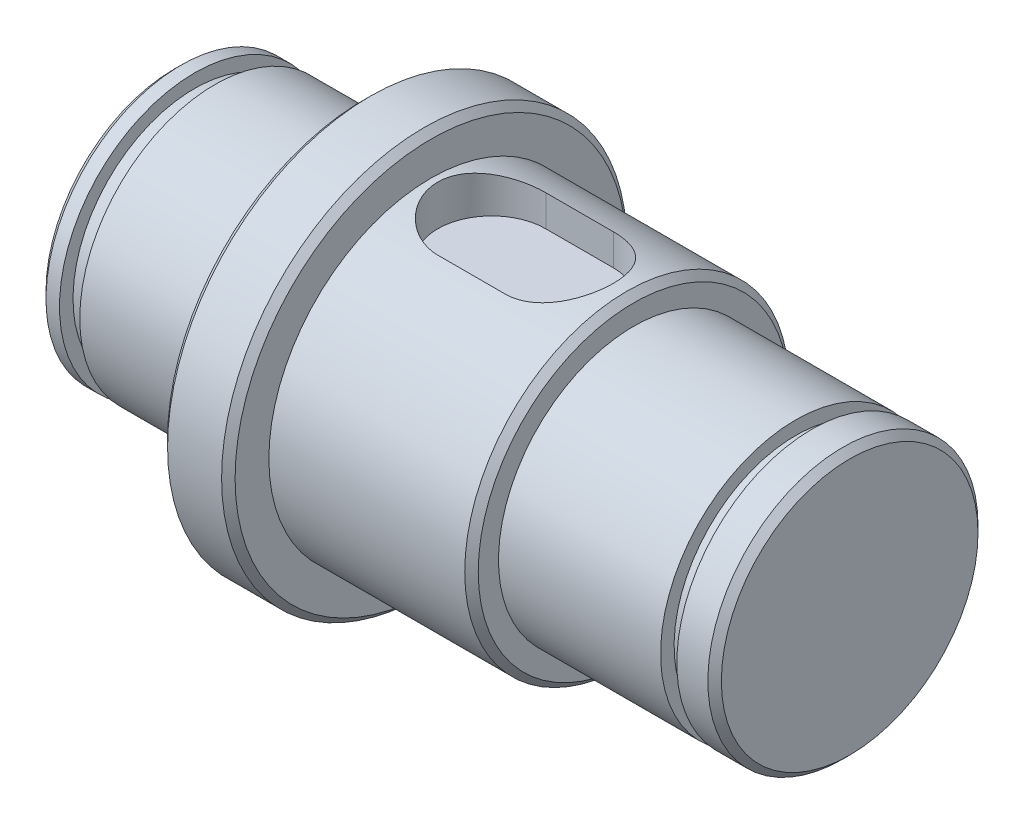
ISO-10303-21;
HEADER;
FILE_DESCRIPTION(('STEP AP214'),'2;1');
FILE_NAME('part.step','',(''),(''),'','','');
FILE_SCHEMA(('AUTOMOTIVE_DESIGN { 1 0 10303 214 1 1 1 1 }'));
ENDSEC;
DATA;
#1=APPLICATION_CONTEXT('core data for automotive mechanical design processes');
#2=APPLICATION_PROTOCOL_DEFINITION('international standard','automotive_design',2000,#1);
#3=PRODUCT_CONTEXT('',#1,'mechanical');
#4=PRODUCT('Part','Part','',(#3));
#5=PRODUCT_RELATED_PRODUCT_CATEGORY('part','',(#4));
#6=PRODUCT_DEFINITION_FORMATION('','',#4);
#7=PRODUCT_DEFINITION_CONTEXT('part definition',#1,'design');
#8=PRODUCT_DEFINITION('design','',#6,#7);
#9=PRODUCT_DEFINITION_SHAPE('','',#8);
#10=(LENGTH_UNIT() NAMED_UNIT(*) SI_UNIT(.MILLI.,.METRE.));
#11=(NAMED_UNIT(*) PLANE_ANGLE_UNIT() SI_UNIT($,.RADIAN.));
#12=(NAMED_UNIT(*) SI_UNIT($,.STERADIAN.) SOLID_ANGLE_UNIT());
#13=UNCERTAINTY_MEASURE_WITH_UNIT(LENGTH_MEASURE(1.E-05),#10,'distance_accuracy_value','');
#14=(GEOMETRIC_REPRESENTATION_CONTEXT(3) GLOBAL_UNCERTAINTY_ASSIGNED_CONTEXT((#13)) GLOBAL_UNIT_ASSIGNED_CONTEXT((#10,
#11,#12)) REPRESENTATION_CONTEXT('',''));
#15=CARTESIAN_POINT('',(0.,0.,0.));
#16=DIRECTION('',(0.,0.,1.));
#17=DIRECTION('',(1.,0.,0.));
#18=AXIS2_PLACEMENT_3D('',#15,#16,#17);
#19=CARTESIAN_POINT('',(25.,0.,0.));
#20=DIRECTION('',(-1.,0.,0.));
#21=DIRECTION('',(0.,0.,1.));
#22=AXIS2_PLACEMENT_3D('',#19,#20,#21);
#23=CYLINDRICAL_SURFACE('',#22,10.);
#24=CARTESIAN_POINT('',(9.,0.,0.));
#25=DIRECTION('',(1.,0.,0.));
#26=DIRECTION('',(0.,0.,-1.));
#27=AXIS2_PLACEMENT_3D('',#24,#25,#26);
#28=CIRCLE('',#27,10.);
#29=CARTESIAN_POINT('',(9.,0.,-10.));
#30=VERTEX_POINT('',#29);
#31=EDGE_CURVE('E327',#30,#30,#28,.T.);
#32=ORIENTED_EDGE('',*,*,#31,.T.);
#33=EDGE_LOOP('',(#32));
#34=FACE_BOUND('',#33,.T.);
#35=CARTESIAN_POINT('',(21.,0.,0.));
#36=DIRECTION('',(-1.,0.,0.));
#37=DIRECTION('',(0.,-1.,0.));
#38=AXIS2_PLACEMENT_3D('',#35,#36,#37);
#39=CIRCLE('',#38,9.99999999999999);
#40=CARTESIAN_POINT('',(21.,-9.99999999999998,0.));
#41=VERTEX_POINT('',#40);
#42=EDGE_CURVE('E201',#41,#41,#39,.T.);
#43=ORIENTED_EDGE('',*,*,#42,.T.);
#44=EDGE_LOOP('',(#43));
#45=FACE_BOUND('',#44,.T.);
#46=ADVANCED_FACE('F50',(#34,#45),#23,.T.);
#47=CARTESIAN_POINT('',(-11.,0.,0.));
#48=DIRECTION('',(-1.,0.,0.));
#49=DIRECTION('',(0.,0.,1.));
#50=AXIS2_PLACEMENT_3D('',#47,#48,#49);
#51=CIRCLE('',#50,10.);
#52=CARTESIAN_POINT('',(-11.,0.,10.));
#53=VERTEX_POINT('',#52);
#54=EDGE_CURVE('E113',#53,#53,#51,.T.);
#55=ORIENTED_EDGE('',*,*,#54,.T.);
#56=EDGE_LOOP('',(#55));
#57=FACE_BOUND('',#56,.T.);
#58=CARTESIAN_POINT('',(-22.,0.,0.));
#59=DIRECTION('',(-1.,0.,0.));
#60=DIRECTION('',(0.,-1.,0.));
#61=AXIS2_PLACEMENT_3D('',#58,#59,#60);
#62=CIRCLE('',#61,10.);
#63=CARTESIAN_POINT('',(-22.,-10.,0.));
#64=VERTEX_POINT('',#63);
#65=EDGE_CURVE('E251',#64,#64,#62,.T.);
#66=ORIENTED_EDGE('',*,*,#65,.F.);
#67=EDGE_LOOP('',(#66));
#68=FACE_BOUND('',#67,.T.);
#69=ADVANCED_FACE('F170',(#57,#68),#23,.T.);
#70=CARTESIAN_POINT('',(-6.,0.,0.));
#71=DIRECTION('',(1.,0.,0.));
#72=DIRECTION('',(0.,0.,-1.));
#73=AXIS2_PLACEMENT_3D('',#70,#71,#72);
#74=CYLINDRICAL_SURFACE('',#73,12.);
#75=CARTESIAN_POINT('',(8.49999999999999,0.,0.));
#76=DIRECTION('',(1.,0.,0.));
#77=DIRECTION('',(0.,0.,-1.));
#78=AXIS2_PLACEMENT_3D('',#75,#76,#77);
#79=CIRCLE('',#78,12.);
#80=CARTESIAN_POINT('',(8.49999999999999,0.,-12.));
#81=VERTEX_POINT('',#80);
#82=EDGE_CURVE('E282',#81,#81,#79,.F.);
#83=ORIENTED_EDGE('',*,*,#82,.T.);
#84=EDGE_LOOP('',(#83));
#85=FACE_BOUND('',#84,.T.);
#86=CARTESIAN_POINT('',(-6.,0.,0.));
#87=DIRECTION('',(1.,0.,0.));
#88=DIRECTION('',(0.,0.,-1.));
#89=AXIS2_PLACEMENT_3D('',#86,#87,#88);
#90=CIRCLE('',#89,12.);
#91=CARTESIAN_POINT('',(-6.,0.,-12.));
#92=VERTEX_POINT('',#91);
#93=EDGE_CURVE('E339',#92,#92,#90,.F.);
#94=ORIENTED_EDGE('',*,*,#93,.F.);
#95=EDGE_LOOP('',(#94));
#96=FACE_BOUND('',#95,.T.);
#97=DIRECTION('',(1.,0.,0.));
#98=VECTOR('',#97,1.);
#99=CARTESIAN_POINT('',(-6.,11.3137084989848,4.));
#100=LINE('',#99,#98);
#101=CARTESIAN_POINT('',(-1.5,11.3137084989848,4.));
#102=VERTEX_POINT('',#101);
#103=CARTESIAN_POINT('',(3.5,11.3137084989848,4.));
#104=VERTEX_POINT('',#103);
#105=EDGE_CURVE('E116',#102,#104,#100,.T.);
#106=ORIENTED_EDGE('',*,*,#105,.F.);
#107=CARTESIAN_POINT('',(-1.5,11.3137084989848,-4.));
#108=CARTESIAN_POINT('',(-1.60913132451253,11.3136910923705,-4.0000143857665));
#109=CARTESIAN_POINT('',(-1.71825291948064,11.3152871024731,-3.99553419554536));
#110=CARTESIAN_POINT('',(-1.9356496613588,11.3215763859361,-3.97769673248752));
#111=CARTESIAN_POINT('',(-2.04392502878085,11.3262688232103,-3.96434185595522));
#112=CARTESIAN_POINT('',(-2.2585447813673,11.3386032840401,-3.92891935076474));
#113=CARTESIAN_POINT('',(-2.36489392408149,11.3462365576019,-3.90687756421021));
#114=CARTESIAN_POINT('',(-2.57521322973238,11.364201918496,-3.85430689648188));
#115=CARTESIAN_POINT('',(-2.67918330654347,11.3745341033652,-3.82377770857634));
#116=CARTESIAN_POINT('',(-2.9863385275441,11.4091190527027,-3.71986482089947));
#117=CARTESIAN_POINT('',(-3.18508665195598,11.4369799021453,-3.63410266896587));
#118=CARTESIAN_POINT('',(-3.56540289833741,11.4991525453998,-3.4322845456982));
#119=CARTESIAN_POINT('',(-3.74696037723297,11.5334682968154,-3.31620997228937));
#120=CARTESIAN_POINT('',(-4.09486864556914,11.6061789182336,-3.05220793355649));
#121=CARTESIAN_POINT('',(-4.26045622848942,11.6446750308563,-2.90330055412141));
#122=CARTESIAN_POINT('',(-4.5648273651136,11.7205540276094,-2.57995313902011));
#123=CARTESIAN_POINT('',(-4.70360614588502,11.7579367125094,-2.40550856651356));
#124=CARTESIAN_POINT('',(-4.95391715905119,11.8285552975691,-2.03041476001125));
#125=CARTESIAN_POINT('',(-5.06464369326119,11.8616574966305,-1.82920040495823));
#126=CARTESIAN_POINT('',(-5.25036925102218,11.9187843500282,-1.40971695235372));
#127=CARTESIAN_POINT('',(-5.32537918861944,11.9428117769099,-1.19145308844236));
#128=CARTESIAN_POINT('',(-5.43494284516145,11.9783628445804,-0.752117395358864));
#129=CARTESIAN_POINT('',(-5.47081308509184,11.9902923605184,-0.531407346429906));
#130=CARTESIAN_POINT('',(-5.50526519922409,12.0017443351774,-0.0867958692352786));
#131=CARTESIAN_POINT('',(-5.50385595838734,12.0012697502156,0.137104785886817));
#132=CARTESIAN_POINT('',(-5.46462290474738,11.9882415502496,0.572415361032319));
#133=CARTESIAN_POINT('',(-5.42822959866961,11.9761624577266,0.783970739663759));
#134=CARTESIAN_POINT('',(-5.3224270547877,11.9418784019559,1.19777632834894));
#135=CARTESIAN_POINT('',(-5.25301598627315,11.9196728772387,1.4000260217555));
#136=CARTESIAN_POINT('',(-5.08231509392962,11.8670267992102,1.79261022537109));
#137=CARTESIAN_POINT('',(-4.98061796939386,11.8364817702071,1.98275302130578));
#138=CARTESIAN_POINT('',(-4.7485580439686,11.7703352504572,2.34369935797278));
#139=CARTESIAN_POINT('',(-4.61818744541233,11.7347323851811,2.51449761883744));
#140=CARTESIAN_POINT('',(-4.32532420781555,11.6602518814889,2.84038544309998));
#141=CARTESIAN_POINT('',(-4.16160988970107,11.6212989752184,2.99435951335509));
#142=CARTESIAN_POINT('',(-3.81020196665418,11.5458957896576,3.27310303719343));
#143=CARTESIAN_POINT('',(-3.62250064500035,11.5094463215614,3.39786305574725));
#144=CARTESIAN_POINT('',(-3.32528704962278,11.4595759659792,3.56109757745215));
#145=CARTESIAN_POINT('',(-3.22274459523252,11.4436484943195,3.61182358389815));
#146=CARTESIAN_POINT('',(-3.01343501904369,11.4140167075143,3.70440095621127));
#147=CARTESIAN_POINT('',(-2.9066696779244,11.4003114674865,3.74625601636388));
#148=CARTESIAN_POINT('',(-2.68978291343352,11.3755873303494,3.82067426911565));
#149=CARTESIAN_POINT('',(-2.57966528689594,11.3645655126344,3.85324757051516));
#150=CARTESIAN_POINT('',(-2.35683184555263,11.3455648512893,3.90883841588792));
#151=CARTESIAN_POINT('',(-2.24411724203817,11.3375846182867,3.93186032329112));
#152=CARTESIAN_POINT('',(-2.02635755344924,11.3254693235584,3.96661962949784));
#153=CARTESIAN_POINT('',(-1.92145048042139,11.3210705251979,3.97913375141091));
#154=CARTESIAN_POINT('',(-1.71103166730016,11.3151843303776,3.99582494949883));
#155=CARTESIAN_POINT('',(-1.60552088433212,11.3136931771535,4.00001278362333));
#156=CARTESIAN_POINT('',(-1.5,11.3137084989848,4.));
#157=B_SPLINE_CURVE_WITH_KNOTS('',3,(#107,#108,#109,#110,#111,#112,#113,#114,#115,#116,#117,
#118,#119,#120,#121,#122,#123,#124,#125,#126,#127,#128,#129,#130,#131,#132,#133,#134,#135,#136,
#137,#138,#139,#140,#141,#142,#143,#144,#145,#146,#147,#148,#149,#150,#151,#152,#153,#154,#155,
#156),.UNSPECIFIED.,.F.,.F.,(4,2,2,2,2,2,2,2,2,2,2,2,2,2,2,2,2,2,2,2,2,2,2,2,4),(0.,
0.32727393894173,0.654459544677847,0.980679087086519,1.30691042048862,1.95841627077208,
2.61032287944837,3.28524582541423,3.96028882145702,4.65295094423118,5.34540127175222,
6.01376445600325,6.68196834813282,7.32396236553654,7.96599198323705,8.61646637994584,
9.26711789045787,9.94834778922914,10.6297973968768,10.9759539762202,11.3219661149517,
11.6675999574416,12.0130757272824,12.3299368411189,12.6463882889711),.UNSPECIFIED.);
#158=CARTESIAN_POINT('',(-1.5,11.3137084989848,-4.));
#159=VERTEX_POINT('',#158);
#160=EDGE_CURVE('E97',#159,#102,#157,.T.);
#161=ORIENTED_EDGE('',*,*,#160,.F.);
#162=DIRECTION('',(1.,0.,0.));
#163=VECTOR('',#162,1.);
#164=CARTESIAN_POINT('',(-6.,11.3137084989848,-4.));
#165=LINE('',#164,#163);
#166=CARTESIAN_POINT('',(3.5,11.3137084989848,-4.));
#167=VERTEX_POINT('',#166);
#168=EDGE_CURVE('E109',#167,#159,#165,.F.);
#169=ORIENTED_EDGE('',*,*,#168,.F.);
#170=CARTESIAN_POINT('',(3.5,11.3137084989848,4.));
#171=CARTESIAN_POINT('',(3.60913132451254,11.3136910923705,4.0000143857665));
#172=CARTESIAN_POINT('',(3.71825291948064,11.3152871024731,3.99553419554536));
#173=CARTESIAN_POINT('',(3.9356496613588,11.3215763859361,3.97769673248752));
#174=CARTESIAN_POINT('',(4.04392502878086,11.3262688232103,3.96434185595522));
#175=CARTESIAN_POINT('',(4.25854478136731,11.3386032840401,3.92891935076474));
#176=CARTESIAN_POINT('',(4.3648939240815,11.3462365576019,3.90687756421021));
#177=CARTESIAN_POINT('',(4.57521322973239,11.364201918496,3.85430689648188));
#178=CARTESIAN_POINT('',(4.67918330654348,11.3745341033652,3.82377770857634));
#179=CARTESIAN_POINT('',(4.98633852754411,11.4091190527027,3.71986482089947));
#180=CARTESIAN_POINT('',(5.18508665195598,11.4369799021453,3.63410266896587));
#181=CARTESIAN_POINT('',(5.56540289833741,11.4991525453998,3.4322845456982));
#182=CARTESIAN_POINT('',(5.74696037723297,11.5334682968154,3.31620997228936));
#183=CARTESIAN_POINT('',(6.09486864556914,11.6061789182336,3.05220793355649));
#184=CARTESIAN_POINT('',(6.26045622848942,11.6446750308563,2.9033005541214));
#185=CARTESIAN_POINT('',(6.56482736511361,11.7205540276094,2.57995313902011));
#186=CARTESIAN_POINT('',(6.70360614588502,11.7579367125094,2.40550856651356));
#187=CARTESIAN_POINT('',(6.9539171590512,11.8285552975691,2.03041476001125));
#188=CARTESIAN_POINT('',(7.06464369326119,11.8616574966305,1.82920040495823));
#189=CARTESIAN_POINT('',(7.25036925102219,11.9187843500282,1.40971695235372));
#190=CARTESIAN_POINT('',(7.32537918861944,11.9428117769099,1.19145308844235));
#191=CARTESIAN_POINT('',(7.43494284516145,11.9783628445804,0.752117395358863));
#192=CARTESIAN_POINT('',(7.47081308509184,11.9902923605184,0.531407346429906));
#193=CARTESIAN_POINT('',(7.50526519922409,12.0017443351774,0.0867958692352784));
#194=CARTESIAN_POINT('',(7.50385595838735,12.0012697502156,-0.137104785886817));
#195=CARTESIAN_POINT('',(7.46462290474738,11.9882415502496,-0.57241536103232));
#196=CARTESIAN_POINT('',(7.42822959866962,11.9761624577266,-0.783970739663759));
#197=CARTESIAN_POINT('',(7.3224270547877,11.9418784019559,-1.19777632834894));
#198=CARTESIAN_POINT('',(7.25301598627315,11.9196728772387,-1.4000260217555));
#199=CARTESIAN_POINT('',(7.08231509392962,11.8670267992102,-1.79261022537109));
#200=CARTESIAN_POINT('',(6.98061796939386,11.8364817702071,-1.98275302130578));
#201=CARTESIAN_POINT('',(6.7485580439686,11.7703352504572,-2.34369935797279));
#202=CARTESIAN_POINT('',(6.61818744541233,11.7347323851811,-2.51449761883744));
#203=CARTESIAN_POINT('',(6.32532420781555,11.6602518814889,-2.84038544309998));
#204=CARTESIAN_POINT('',(6.16160988970107,11.6212989752184,-2.99435951335509));
#205=CARTESIAN_POINT('',(5.81020196665418,11.5458957896576,-3.27310303719343));
#206=CARTESIAN_POINT('',(5.62250064500035,11.5094463215614,-3.39786305574726));
#207=CARTESIAN_POINT('',(5.32528704962278,11.4595759659792,-3.56109757745215));
#208=CARTESIAN_POINT('',(5.22274459523252,11.4436484943195,-3.61182358389815));
#209=CARTESIAN_POINT('',(5.01343501904369,11.4140167075143,-3.70440095621127));
#210=CARTESIAN_POINT('',(4.9066696779244,11.4003114674865,-3.74625601636388));
#211=CARTESIAN_POINT('',(4.68978291343353,11.3755873303494,-3.82067426911565));
#212=CARTESIAN_POINT('',(4.57966528689594,11.3645655126344,-3.85324757051516));
#213=CARTESIAN_POINT('',(4.35683184555263,11.3455648512893,-3.90883841588792));
#214=CARTESIAN_POINT('',(4.24411724203817,11.3375846182867,-3.93186032329112));
#215=CARTESIAN_POINT('',(4.02635755344924,11.3254693235584,-3.96661962949784));
#216=CARTESIAN_POINT('',(3.92145048042139,11.3210705251979,-3.97913375141091));
#217=CARTESIAN_POINT('',(3.71103166730016,11.3151843303776,-3.99582494949883));
#218=CARTESIAN_POINT('',(3.60552088433212,11.3136931771535,-4.00001278362333));
#219=CARTESIAN_POINT('',(3.5,11.3137084989848,-4.));
#220=B_SPLINE_CURVE_WITH_KNOTS('',3,(#170,#171,#172,#173,#174,#175,#176,#177,#178,#179,#180,
#181,#182,#183,#184,#185,#186,#187,#188,#189,#190,#191,#192,#193,#194,#195,#196,#197,#198,#199,
#200,#201,#202,#203,#204,#205,#206,#207,#208,#209,#210,#211,#212,#213,#214,#215,#216,#217,#218,
#219),.UNSPECIFIED.,.F.,.F.,(4,2,2,2,2,2,2,2,2,2,2,2,2,2,2,2,2,2,2,2,2,2,2,2,4),(0.,
0.327273938941731,0.654459544677848,0.980679087086521,1.30691042048862,1.95841627077208,
2.61032287944837,3.28524582541423,3.96028882145703,4.65295094423118,5.34540127175222,
6.01376445600324,6.68196834813282,7.32396236553654,7.96599198323704,8.61646637994584,
9.26711789045787,9.94834778922914,10.6297973968768,10.9759539762202,11.3219661149517,
11.6675999574416,12.0130757272824,12.3299368411189,12.6463882889711),.UNSPECIFIED.);
#221=EDGE_CURVE('E67',#104,#167,#220,.T.);
#222=ORIENTED_EDGE('',*,*,#221,.F.);
#223=EDGE_LOOP('',(#106,#161,#169,#222));
#224=FACE_BOUND('',#223,.T.);
#225=ADVANCED_FACE('F115',(#85,#96,#224),#74,.T.);
#226=CARTESIAN_POINT('',(9.,0.,0.));
#227=DIRECTION('',(1.,0.,0.));
#228=DIRECTION('',(0.,0.,-1.));
#229=AXIS2_PLACEMENT_3D('',#226,#227,#228);
#230=PLANE('',#229);
#231=CARTESIAN_POINT('',(9.,0.,0.));
#232=DIRECTION('',(1.,0.,0.));
#233=DIRECTION('',(0.,0.,-1.));
#234=AXIS2_PLACEMENT_3D('',#231,#232,#233);
#235=CIRCLE('',#234,11.5);
#236=CARTESIAN_POINT('',(9.,0.,-11.5));
#237=VERTEX_POINT('',#236);
#238=EDGE_CURVE('E275',#237,#237,#235,.T.);
#239=ORIENTED_EDGE('',*,*,#238,.T.);
#240=EDGE_LOOP('',(#239));
#241=FACE_BOUND('',#240,.T.);
#242=ORIENTED_EDGE('',*,*,#31,.F.);
#243=EDGE_LOOP('',(#242));
#244=FACE_BOUND('',#243,.T.);
#245=ADVANCED_FACE('F346',(#241,#244),#230,.T.);
#246=CARTESIAN_POINT('',(36.4264068711929,0.,0.));
#247=DIRECTION('',(-1.,0.,0.));
#248=DIRECTION('',(0.,0.,1.));
#249=AXIS2_PLACEMENT_3D('',#246,#247,#248);
#250=CYLINDRICAL_SURFACE('',#249,15.);
#251=CARTESIAN_POINT('',(-10.5,0.,0.));
#252=DIRECTION('',(-1.,0.,0.));
#253=DIRECTION('',(0.,0.,1.));
#254=AXIS2_PLACEMENT_3D('',#251,#252,#253);
#255=CIRCLE('',#254,15.);
#256=CARTESIAN_POINT('',(-10.5,0.,15.));
#257=VERTEX_POINT('',#256);
#258=EDGE_CURVE('E276',#257,#257,#255,.F.);
#259=ORIENTED_EDGE('',*,*,#258,.T.);
#260=EDGE_LOOP('',(#259));
#261=FACE_BOUND('',#260,.T.);
#262=CARTESIAN_POINT('',(-6.5,0.,0.));
#263=DIRECTION('',(1.,0.,0.));
#264=DIRECTION('',(0.,0.,-1.));
#265=AXIS2_PLACEMENT_3D('',#262,#263,#264);
#266=CIRCLE('',#265,15.);
#267=CARTESIAN_POINT('',(-6.5,0.,-15.));
#268=VERTEX_POINT('',#267);
#269=EDGE_CURVE('E324',#268,#268,#266,.F.);
#270=ORIENTED_EDGE('',*,*,#269,.T.);
#271=EDGE_LOOP('',(#270));
#272=FACE_BOUND('',#271,.T.);
#273=ADVANCED_FACE('F348',(#261,#272),#250,.T.);
#274=CARTESIAN_POINT('',(-11.,0.,0.));
#275=DIRECTION('',(-1.,0.,0.));
#276=DIRECTION('',(0.,0.,1.));
#277=AXIS2_PLACEMENT_3D('',#274,#275,#276);
#278=PLANE('',#277);
#279=CARTESIAN_POINT('',(-11.,0.,0.));
#280=DIRECTION('',(-1.,0.,0.));
#281=DIRECTION('',(0.,0.,1.));
#282=AXIS2_PLACEMENT_3D('',#279,#280,#281);
#283=CIRCLE('',#282,14.5);
#284=CARTESIAN_POINT('',(-11.,0.,14.5));
#285=VERTEX_POINT('',#284);
#286=EDGE_CURVE('E317',#285,#285,#283,.T.);
#287=ORIENTED_EDGE('',*,*,#286,.T.);
#288=EDGE_LOOP('',(#287));
#289=FACE_BOUND('',#288,.T.);
#290=ORIENTED_EDGE('',*,*,#54,.F.);
#291=EDGE_LOOP('',(#290));
#292=FACE_BOUND('',#291,.T.);
#293=ADVANCED_FACE('F354',(#289,#292),#278,.T.);
#294=CARTESIAN_POINT('',(-6.,0.,0.));
#295=DIRECTION('',(1.,0.,0.));
#296=DIRECTION('',(0.,0.,-1.));
#297=AXIS2_PLACEMENT_3D('',#294,#295,#296);
#298=PLANE('',#297);
#299=CARTESIAN_POINT('',(-6.,0.,0.));
#300=DIRECTION('',(1.,0.,0.));
#301=DIRECTION('',(0.,0.,-1.));
#302=AXIS2_PLACEMENT_3D('',#299,#300,#301);
#303=CIRCLE('',#302,14.5);
#304=CARTESIAN_POINT('',(-6.,0.,-14.5));
#305=VERTEX_POINT('',#304);
#306=EDGE_CURVE('E270',#305,#305,#303,.T.);
#307=ORIENTED_EDGE('',*,*,#306,.T.);
#308=EDGE_LOOP('',(#307));
#309=FACE_BOUND('',#308,.T.);
#310=ORIENTED_EDGE('',*,*,#93,.T.);
#311=EDGE_LOOP('',(#310));
#312=FACE_BOUND('',#311,.T.);
#313=ADVANCED_FACE('F168',(#309,#312),#298,.T.);
#314=CARTESIAN_POINT('',(-1.5,15.001,0.));
#315=DIRECTION('',(0.,-1.,0.));
#316=DIRECTION('',(0.,0.,-1.));
#317=AXIS2_PLACEMENT_3D('',#314,#315,#316);
#318=CYLINDRICAL_SURFACE('',#317,4.);
#319=ORIENTED_EDGE('',*,*,#160,.T.);
#320=DIRECTION('',(0.,-1.,0.));
#321=VECTOR('',#320,1.);
#322=CARTESIAN_POINT('',(-1.5,15.001,4.));
#323=LINE('',#322,#321);
#324=CARTESIAN_POINT('',(-1.5,9.,4.));
#325=VERTEX_POINT('',#324);
#326=EDGE_CURVE('E75',#102,#325,#323,.T.);
#327=ORIENTED_EDGE('',*,*,#326,.T.);
#328=CARTESIAN_POINT('',(-1.5,9.,0.));
#329=DIRECTION('',(0.,1.,0.));
#330=DIRECTION('',(0.,0.,1.));
#331=AXIS2_PLACEMENT_3D('',#328,#329,#330);
#332=CIRCLE('',#331,4.);
#333=CARTESIAN_POINT('',(-1.5,9.,-4.));
#334=VERTEX_POINT('',#333);
#335=EDGE_CURVE('E100',#334,#325,#332,.T.);
#336=ORIENTED_EDGE('',*,*,#335,.F.);
#337=DIRECTION('',(0.,-1.,0.));
#338=VECTOR('',#337,1.);
#339=CARTESIAN_POINT('',(-1.5,15.001,-4.));
#340=LINE('',#339,#338);
#341=EDGE_CURVE('E93',#159,#334,#340,.T.);
#342=ORIENTED_EDGE('',*,*,#341,.F.);
#343=EDGE_LOOP('',(#319,#327,#336,#342));
#344=FACE_BOUND('',#343,.T.);
#345=ADVANCED_FACE('F95',(#344),#318,.F.);
#346=CARTESIAN_POINT('',(-1.5,15.001,4.));
#347=DIRECTION('',(0.,0.,-1.));
#348=DIRECTION('',(-1.,0.,0.));
#349=AXIS2_PLACEMENT_3D('',#346,#347,#348);
#350=PLANE('',#349);
#351=ORIENTED_EDGE('',*,*,#105,.T.);
#352=DIRECTION('',(0.,-1.,0.));
#353=VECTOR('',#352,1.);
#354=CARTESIAN_POINT('',(3.5,15.001,4.));
#355=LINE('',#354,#353);
#356=CARTESIAN_POINT('',(3.5,9.,4.));
#357=VERTEX_POINT('',#356);
#358=EDGE_CURVE('E220',#104,#357,#355,.T.);
#359=ORIENTED_EDGE('',*,*,#358,.T.);
#360=DIRECTION('',(1.,0.,0.));
#361=VECTOR('',#360,1.);
#362=CARTESIAN_POINT('',(-1.5,9.,4.));
#363=LINE('',#362,#361);
#364=EDGE_CURVE('E121',#325,#357,#363,.T.);
#365=ORIENTED_EDGE('',*,*,#364,.F.);
#366=ORIENTED_EDGE('',*,*,#326,.F.);
#367=EDGE_LOOP('',(#351,#359,#365,#366));
#368=FACE_BOUND('',#367,.T.);
#369=ADVANCED_FACE('F163',(#368),#350,.T.);
#370=CARTESIAN_POINT('',(3.5,15.001,0.));
#371=DIRECTION('',(0.,-1.,0.));
#372=DIRECTION('',(0.,0.,-1.));
#373=AXIS2_PLACEMENT_3D('',#370,#371,#372);
#374=CYLINDRICAL_SURFACE('',#373,4.);
#375=ORIENTED_EDGE('',*,*,#221,.T.);
#376=DIRECTION('',(0.,-1.,0.));
#377=VECTOR('',#376,1.);
#378=CARTESIAN_POINT('',(3.5,15.001,-4.));
#379=LINE('',#378,#377);
#380=CARTESIAN_POINT('',(3.5,9.,-4.));
#381=VERTEX_POINT('',#380);
#382=EDGE_CURVE('E105',#167,#381,#379,.T.);
#383=ORIENTED_EDGE('',*,*,#382,.T.);
#384=CARTESIAN_POINT('',(3.5,9.,0.));
#385=DIRECTION('',(0.,1.,0.));
#386=DIRECTION('',(0.,0.,1.));
#387=AXIS2_PLACEMENT_3D('',#384,#385,#386);
#388=CIRCLE('',#387,4.);
#389=EDGE_CURVE('E236',#357,#381,#388,.T.);
#390=ORIENTED_EDGE('',*,*,#389,.F.);
#391=ORIENTED_EDGE('',*,*,#358,.F.);
#392=EDGE_LOOP('',(#375,#383,#390,#391));
#393=FACE_BOUND('',#392,.T.);
#394=ADVANCED_FACE('F160',(#393),#374,.F.);
#395=CARTESIAN_POINT('',(-1.5,15.001,-4.));
#396=DIRECTION('',(0.,0.,1.));
#397=DIRECTION('',(1.,0.,0.));
#398=AXIS2_PLACEMENT_3D('',#395,#396,#397);
#399=PLANE('',#398);
#400=ORIENTED_EDGE('',*,*,#168,.T.);
#401=ORIENTED_EDGE('',*,*,#341,.T.);
#402=DIRECTION('',(-1.,0.,0.));
#403=VECTOR('',#402,1.);
#404=CARTESIAN_POINT('',(-1.5,9.,-4.));
#405=LINE('',#404,#403);
#406=EDGE_CURVE('E106',#381,#334,#405,.T.);
#407=ORIENTED_EDGE('',*,*,#406,.F.);
#408=ORIENTED_EDGE('',*,*,#382,.F.);
#409=EDGE_LOOP('',(#400,#401,#407,#408));
#410=FACE_BOUND('',#409,.T.);
#411=ADVANCED_FACE('F110',(#410),#399,.T.);
#412=CARTESIAN_POINT('',(-1.5,9.,0.));
#413=DIRECTION('',(0.,1.,0.));
#414=DIRECTION('',(0.,0.,1.));
#415=AXIS2_PLACEMENT_3D('',#412,#413,#414);
#416=PLANE('',#415);
#417=ORIENTED_EDGE('',*,*,#335,.T.);
#418=ORIENTED_EDGE('',*,*,#364,.T.);
#419=ORIENTED_EDGE('',*,*,#389,.T.);
#420=ORIENTED_EDGE('',*,*,#406,.T.);
#421=EDGE_LOOP('',(#417,#418,#419,#420));
#422=FACE_BOUND('',#421,.T.);
#423=ADVANCED_FACE('F144',(#422),#416,.T.);
#424=CARTESIAN_POINT('',(-11.,0.,0.));
#425=DIRECTION('',(1.,0.,0.));
#426=DIRECTION('',(0.,0.,-1.));
#427=AXIS2_PLACEMENT_3D('',#424,#425,#426);
#428=CONICAL_SURFACE('',#427,14.5,0.785398163397443);
#429=ORIENTED_EDGE('',*,*,#258,.F.);
#430=EDGE_LOOP('',(#429));
#431=FACE_BOUND('',#430,.T.);
#432=ORIENTED_EDGE('',*,*,#286,.F.);
#433=EDGE_LOOP('',(#432));
#434=FACE_BOUND('',#433,.T.);
#435=ADVANCED_FACE('F395',(#431,#434),#428,.T.);
#436=CARTESIAN_POINT('',(-6.5,0.,0.));
#437=DIRECTION('',(-1.,0.,0.));
#438=DIRECTION('',(0.,0.,1.));
#439=AXIS2_PLACEMENT_3D('',#436,#437,#438);
#440=CONICAL_SURFACE('',#439,15.,0.785398163397447);
#441=ORIENTED_EDGE('',*,*,#306,.F.);
#442=EDGE_LOOP('',(#441));
#443=FACE_BOUND('',#442,.T.);
#444=ORIENTED_EDGE('',*,*,#269,.F.);
#445=EDGE_LOOP('',(#444));
#446=FACE_BOUND('',#445,.T.);
#447=ADVANCED_FACE('F390',(#443,#446),#440,.T.);
#448=CARTESIAN_POINT('',(9.,0.,0.));
#449=DIRECTION('',(-1.,0.,0.));
#450=DIRECTION('',(0.,0.,1.));
#451=AXIS2_PLACEMENT_3D('',#448,#449,#450);
#452=CONICAL_SURFACE('',#451,11.5,0.785398163397447);
#453=ORIENTED_EDGE('',*,*,#82,.F.);
#454=EDGE_LOOP('',(#453));
#455=FACE_BOUND('',#454,.T.);
#456=ORIENTED_EDGE('',*,*,#238,.F.);
#457=EDGE_LOOP('',(#456));
#458=FACE_BOUND('',#457,.T.);
#459=ADVANCED_FACE('F384',(#455,#458),#452,.T.);
#460=CARTESIAN_POINT('',(-23.5,10.,0.));
#461=DIRECTION('',(1.,0.,0.));
#462=DIRECTION('',(0.,1.,0.));
#463=AXIS2_PLACEMENT_3D('',#460,#461,#462);
#464=PLANE('',#463);
#465=CARTESIAN_POINT('',(-23.5,0.,0.));
#466=DIRECTION('',(-1.,0.,0.));
#467=DIRECTION('',(0.,-1.,0.));
#468=AXIS2_PLACEMENT_3D('',#465,#466,#467);
#469=CIRCLE('',#468,8.99999999999999);
#470=CARTESIAN_POINT('',(-23.5,-8.99999999999999,0.));
#471=VERTEX_POINT('',#470);
#472=EDGE_CURVE('E156',#471,#471,#469,.T.);
#473=ORIENTED_EDGE('',*,*,#472,.T.);
#474=EDGE_LOOP('',(#473));
#475=FACE_BOUND('',#474,.T.);
#476=CARTESIAN_POINT('',(-23.5,0.,0.));
#477=DIRECTION('',(-1.,0.,0.));
#478=DIRECTION('',(0.,-1.,0.));
#479=AXIS2_PLACEMENT_3D('',#476,#477,#478);
#480=CIRCLE('',#479,10.);
#481=CARTESIAN_POINT('',(-23.5,-10.,0.));
#482=VERTEX_POINT('',#481);
#483=EDGE_CURVE('E255',#482,#482,#480,.T.);
#484=ORIENTED_EDGE('',*,*,#483,.F.);
#485=EDGE_LOOP('',(#484));
#486=FACE_BOUND('',#485,.T.);
#487=ADVANCED_FACE('F142',(#475,#486),#464,.T.);
#488=CARTESIAN_POINT('',(-25.,0.,0.));
#489=DIRECTION('',(-1.,0.,0.));
#490=DIRECTION('',(0.,-1.,0.));
#491=AXIS2_PLACEMENT_3D('',#488,#489,#490);
#492=CYLINDRICAL_SURFACE('',#491,8.99999999999999);
#493=CARTESIAN_POINT('',(-22.,0.,0.));
#494=DIRECTION('',(-1.,0.,0.));
#495=DIRECTION('',(0.,-1.,0.));
#496=AXIS2_PLACEMENT_3D('',#493,#494,#495);
#497=CIRCLE('',#496,8.99999999999999);
#498=CARTESIAN_POINT('',(-22.,-8.99999999999999,0.));
#499=VERTEX_POINT('',#498);
#500=EDGE_CURVE('E210',#499,#499,#497,.T.);
#501=ORIENTED_EDGE('',*,*,#500,.T.);
#502=EDGE_LOOP('',(#501));
#503=FACE_BOUND('',#502,.T.);
#504=ORIENTED_EDGE('',*,*,#472,.F.);
#505=EDGE_LOOP('',(#504));
#506=FACE_BOUND('',#505,.T.);
#507=ADVANCED_FACE('F310',(#503,#506),#492,.T.);
#508=CARTESIAN_POINT('',(-22.,10.,0.));
#509=DIRECTION('',(-1.,0.,0.));
#510=DIRECTION('',(0.,-1.,0.));
#511=AXIS2_PLACEMENT_3D('',#508,#509,#510);
#512=PLANE('',#511);
#513=ORIENTED_EDGE('',*,*,#65,.T.);
#514=EDGE_LOOP('',(#513));
#515=FACE_BOUND('',#514,.T.);
#516=ORIENTED_EDGE('',*,*,#500,.F.);
#517=EDGE_LOOP('',(#516));
#518=FACE_BOUND('',#517,.T.);
#519=ADVANCED_FACE('F303',(#515,#518),#512,.T.);
#520=CARTESIAN_POINT('',(-25.,0.,0.));
#521=DIRECTION('',(1.,0.,0.));
#522=DIRECTION('',(0.,0.,-1.));
#523=AXIS2_PLACEMENT_3D('',#520,#521,#522);
#524=PLANE('',#523);
#525=CARTESIAN_POINT('',(-25.,0.,0.));
#526=DIRECTION('',(1.,0.,0.));
#527=DIRECTION('',(0.,0.,-1.));
#528=AXIS2_PLACEMENT_3D('',#525,#526,#527);
#529=CIRCLE('',#528,9.49999999999997);
#530=CARTESIAN_POINT('',(-25.,0.,-9.49999999999997));
#531=VERTEX_POINT('',#530);
#532=EDGE_CURVE('E315',#531,#531,#529,.F.);
#533=ORIENTED_EDGE('',*,*,#532,.T.);
#534=EDGE_LOOP('',(#533));
#535=FACE_BOUND('',#534,.T.);
#536=ADVANCED_FACE('F301',(#535),#524,.F.);
#537=CARTESIAN_POINT('',(-24.5,0.,0.));
#538=DIRECTION('',(1.,0.,0.));
#539=DIRECTION('',(0.,0.,-1.));
#540=AXIS2_PLACEMENT_3D('',#537,#538,#539);
#541=CONICAL_SURFACE('',#540,10.,0.785398163397459);
#542=ORIENTED_EDGE('',*,*,#532,.F.);
#543=EDGE_LOOP('',(#542));
#544=FACE_BOUND('',#543,.T.);
#545=CARTESIAN_POINT('',(-24.5,0.,0.));
#546=DIRECTION('',(1.,0.,0.));
#547=DIRECTION('',(0.,0.,-1.));
#548=AXIS2_PLACEMENT_3D('',#545,#546,#547);
#549=CIRCLE('',#548,10.);
#550=CARTESIAN_POINT('',(-24.5,0.,-10.));
#551=VERTEX_POINT('',#550);
#552=EDGE_CURVE('E318',#551,#551,#549,.T.);
#553=ORIENTED_EDGE('',*,*,#552,.F.);
#554=EDGE_LOOP('',(#553));
#555=FACE_BOUND('',#554,.T.);
#556=ADVANCED_FACE('F185',(#544,#555),#541,.T.);
#557=ORIENTED_EDGE('',*,*,#552,.T.);
#558=EDGE_LOOP('',(#557));
#559=FACE_BOUND('',#558,.T.);
#560=ORIENTED_EDGE('',*,*,#483,.T.);
#561=EDGE_LOOP('',(#560));
#562=FACE_BOUND('',#561,.T.);
#563=ADVANCED_FACE('F173',(#559,#562),#23,.T.);
#564=CARTESIAN_POINT('',(22.2,10.,0.));
#565=DIRECTION('',(-1.,0.,0.));
#566=DIRECTION('',(0.,-1.,0.));
#567=AXIS2_PLACEMENT_3D('',#564,#565,#566);
#568=PLANE('',#567);
#569=CARTESIAN_POINT('',(22.2,0.,0.));
#570=DIRECTION('',(-1.,0.,0.));
#571=DIRECTION('',(0.,-1.,0.));
#572=AXIS2_PLACEMENT_3D('',#569,#570,#571);
#573=CIRCLE('',#572,9.99999999999999);
#574=CARTESIAN_POINT('',(22.2,-9.99999999999998,0.));
#575=VERTEX_POINT('',#574);
#576=EDGE_CURVE('E198',#575,#575,#573,.T.);
#577=ORIENTED_EDGE('',*,*,#576,.T.);
#578=EDGE_LOOP('',(#577));
#579=FACE_BOUND('',#578,.T.);
#580=CARTESIAN_POINT('',(22.2,0.,0.));
#581=DIRECTION('',(-1.,0.,0.));
#582=DIRECTION('',(0.,-1.,0.));
#583=AXIS2_PLACEMENT_3D('',#580,#581,#582);
#584=CIRCLE('',#583,8.99999999999999);
#585=CARTESIAN_POINT('',(22.2,-8.99999999999998,0.));
#586=VERTEX_POINT('',#585);
#587=EDGE_CURVE('E155',#586,#586,#584,.T.);
#588=ORIENTED_EDGE('',*,*,#587,.F.);
#589=EDGE_LOOP('',(#588));
#590=FACE_BOUND('',#589,.T.);
#591=ADVANCED_FACE('F184',(#579,#590),#568,.T.);
#592=CARTESIAN_POINT('',(-25.,0.,0.));
#593=DIRECTION('',(-1.,0.,0.));
#594=DIRECTION('',(0.,-1.,0.));
#595=AXIS2_PLACEMENT_3D('',#592,#593,#594);
#596=CYLINDRICAL_SURFACE('',#595,8.99999999999999);
#597=ORIENTED_EDGE('',*,*,#587,.T.);
#598=EDGE_LOOP('',(#597));
#599=FACE_BOUND('',#598,.T.);
#600=CARTESIAN_POINT('',(21.,0.,0.));
#601=DIRECTION('',(-1.,0.,0.));
#602=DIRECTION('',(0.,-1.,0.));
#603=AXIS2_PLACEMENT_3D('',#600,#601,#602);
#604=CIRCLE('',#603,8.99999999999999);
#605=CARTESIAN_POINT('',(21.,-8.99999999999998,0.));
#606=VERTEX_POINT('',#605);
#607=EDGE_CURVE('E206',#606,#606,#604,.T.);
#608=ORIENTED_EDGE('',*,*,#607,.F.);
#609=EDGE_LOOP('',(#608));
#610=FACE_BOUND('',#609,.T.);
#611=ADVANCED_FACE('F296',(#599,#610),#596,.T.);
#612=CARTESIAN_POINT('',(21.,10.,0.));
#613=DIRECTION('',(1.,0.,0.));
#614=DIRECTION('',(0.,1.,0.));
#615=AXIS2_PLACEMENT_3D('',#612,#613,#614);
#616=PLANE('',#615);
#617=ORIENTED_EDGE('',*,*,#607,.T.);
#618=EDGE_LOOP('',(#617));
#619=FACE_BOUND('',#618,.T.);
#620=ORIENTED_EDGE('',*,*,#42,.F.);
#621=EDGE_LOOP('',(#620));
#622=FACE_BOUND('',#621,.T.);
#623=ADVANCED_FACE('F291',(#619,#622),#616,.T.);
#624=CARTESIAN_POINT('',(25.,0.,0.));
#625=DIRECTION('',(1.,0.,0.));
#626=DIRECTION('',(0.,0.,-1.));
#627=AXIS2_PLACEMENT_3D('',#624,#625,#626);
#628=PLANE('',#627);
#629=CARTESIAN_POINT('',(25.,0.,0.));
#630=DIRECTION('',(1.,0.,0.));
#631=DIRECTION('',(0.,0.,-1.));
#632=AXIS2_PLACEMENT_3D('',#629,#630,#631);
#633=CIRCLE('',#632,9.49999999999998);
#634=CARTESIAN_POINT('',(25.,0.,-9.49999999999998));
#635=VERTEX_POINT('',#634);
#636=EDGE_CURVE('E60',#635,#635,#633,.T.);
#637=ORIENTED_EDGE('',*,*,#636,.T.);
#638=EDGE_LOOP('',(#637));
#639=FACE_BOUND('',#638,.T.);
#640=ADVANCED_FACE('F192',(#639),#628,.T.);
#641=CARTESIAN_POINT('',(25.,0.,0.));
#642=DIRECTION('',(-1.,0.,0.));
#643=DIRECTION('',(0.,0.,1.));
#644=AXIS2_PLACEMENT_3D('',#641,#642,#643);
#645=CONICAL_SURFACE('',#644,9.49999999999998,0.785398163397448);
#646=CARTESIAN_POINT('',(24.5,0.,0.));
#647=DIRECTION('',(1.,0.,0.));
#648=DIRECTION('',(0.,0.,-1.));
#649=AXIS2_PLACEMENT_3D('',#646,#647,#648);
#650=CIRCLE('',#649,10.);
#651=CARTESIAN_POINT('',(24.5,0.,-10.));
#652=VERTEX_POINT('',#651);
#653=EDGE_CURVE('E12',#652,#652,#650,.F.);
#654=ORIENTED_EDGE('',*,*,#653,.F.);
#655=EDGE_LOOP('',(#654));
#656=FACE_BOUND('',#655,.T.);
#657=ORIENTED_EDGE('',*,*,#636,.F.);
#658=EDGE_LOOP('',(#657));
#659=FACE_BOUND('',#658,.T.);
#660=ADVANCED_FACE('F53',(#656,#659),#645,.T.);
#661=ORIENTED_EDGE('',*,*,#653,.T.);
#662=EDGE_LOOP('',(#661));
#663=FACE_BOUND('',#662,.T.);
#664=ORIENTED_EDGE('',*,*,#576,.F.);
#665=EDGE_LOOP('',(#664));
#666=FACE_BOUND('',#665,.T.);
#667=ADVANCED_FACE('F174',(#663,#666),#23,.T.);
#668=CLOSED_SHELL('',(#46,#69,#225,#245,#273,#293,#313,#345,#369,#394,#411,#423,#435,#447,#459,
#487,#507,#519,#536,#556,#563,#591,#611,#623,#640,#660,#667));
#669=MANIFOLD_SOLID_BREP('B2',#668);
#670=ADVANCED_BREP_SHAPE_REPRESENTATION('',(#18,#669),#14);
#671=SHAPE_DEFINITION_REPRESENTATION(#9,#670);
ENDSEC;
END-ISO-10303-21;
